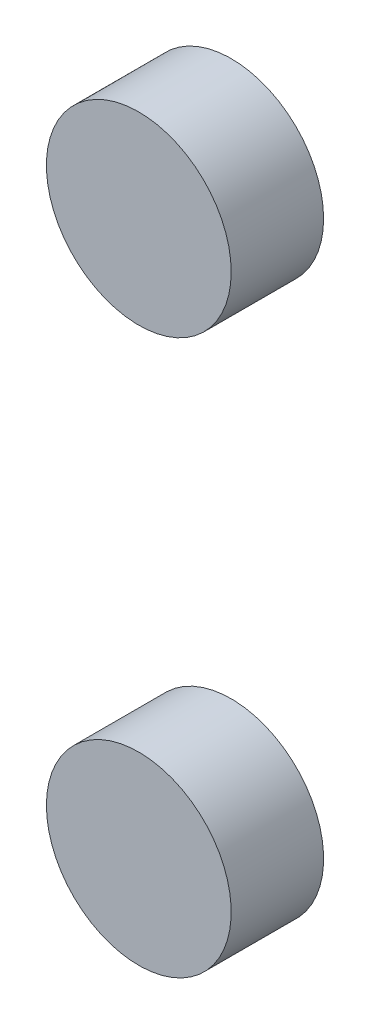
ISO-10303-21;
HEADER;
FILE_DESCRIPTION(('STEP AP214'),'2;1');
FILE_NAME('part.step','',(''),(''),'','','');
FILE_SCHEMA(('AUTOMOTIVE_DESIGN { 1 0 10303 214 1 1 1 1 }'));
ENDSEC;
DATA;
#1=APPLICATION_CONTEXT('core data for automotive mechanical design processes');
#2=APPLICATION_PROTOCOL_DEFINITION('international standard','automotive_design',2000,#1);
#3=PRODUCT_CONTEXT('',#1,'mechanical');
#4=PRODUCT('Part','Part','',(#3));
#5=PRODUCT_RELATED_PRODUCT_CATEGORY('part','',(#4));
#6=PRODUCT_DEFINITION_FORMATION('','',#4);
#7=PRODUCT_DEFINITION_CONTEXT('part definition',#1,'design');
#8=PRODUCT_DEFINITION('design','',#6,#7);
#9=PRODUCT_DEFINITION_SHAPE('','',#8);
#10=(LENGTH_UNIT() NAMED_UNIT(*) SI_UNIT(.MILLI.,.METRE.));
#11=(NAMED_UNIT(*) PLANE_ANGLE_UNIT() SI_UNIT($,.RADIAN.));
#12=(NAMED_UNIT(*) SI_UNIT($,.STERADIAN.) SOLID_ANGLE_UNIT());
#13=UNCERTAINTY_MEASURE_WITH_UNIT(LENGTH_MEASURE(1.E-05),#10,'distance_accuracy_value','');
#14=(GEOMETRIC_REPRESENTATION_CONTEXT(3) GLOBAL_UNCERTAINTY_ASSIGNED_CONTEXT((#13)) GLOBAL_UNIT_ASSIGNED_CONTEXT((#10,
#11,#12)) REPRESENTATION_CONTEXT('',''));
#15=CARTESIAN_POINT('',(0.,0.,0.));
#16=DIRECTION('',(0.,0.,1.));
#17=DIRECTION('',(1.,0.,0.));
#18=AXIS2_PLACEMENT_3D('',#15,#16,#17);
#19=CARTESIAN_POINT('',(0.,-6.,2.));
#20=DIRECTION('',(0.,0.,-1.));
#21=DIRECTION('',(-1.,0.,0.));
#22=AXIS2_PLACEMENT_3D('',#19,#20,#21);
#23=CYLINDRICAL_SURFACE('',#22,2.);
#24=CARTESIAN_POINT('',(0.,-6.,2.));
#25=DIRECTION('',(0.,0.,1.));
#26=DIRECTION('',(-1.,0.,0.));
#27=AXIS2_PLACEMENT_3D('',#24,#25,#26);
#28=CIRCLE('',#27,2.);
#29=CARTESIAN_POINT('',(-2.,-6.,2.));
#30=VERTEX_POINT('',#29);
#31=EDGE_CURVE('E11',#30,#30,#28,.T.);
#32=ORIENTED_EDGE('',*,*,#31,.F.);
#33=EDGE_LOOP('',(#32));
#34=FACE_BOUND('',#33,.T.);
#35=CARTESIAN_POINT('',(0.,-6.,0.));
#36=DIRECTION('',(0.,0.,1.));
#37=DIRECTION('',(-1.,0.,0.));
#38=AXIS2_PLACEMENT_3D('',#35,#36,#37);
#39=CIRCLE('',#38,2.);
#40=CARTESIAN_POINT('',(-2.,-6.,0.));
#41=VERTEX_POINT('',#40);
#42=EDGE_CURVE('E42',#41,#41,#39,.T.);
#43=ORIENTED_EDGE('',*,*,#42,.T.);
#44=EDGE_LOOP('',(#43));
#45=FACE_BOUND('',#44,.T.);
#46=ADVANCED_FACE('F39',(#34,#45),#23,.T.);
#47=CARTESIAN_POINT('',(0.,-6.,2.));
#48=DIRECTION('',(0.,0.,-1.));
#49=DIRECTION('',(-1.,0.,0.));
#50=AXIS2_PLACEMENT_3D('',#47,#48,#49);
#51=PLANE('',#50);
#52=ORIENTED_EDGE('',*,*,#31,.T.);
#53=EDGE_LOOP('',(#52));
#54=FACE_BOUND('',#53,.T.);
#55=ADVANCED_FACE('F54',(#54),#51,.F.);
#56=CARTESIAN_POINT('',(0.,-6.,0.));
#57=DIRECTION('',(0.,0.,-1.));
#58=DIRECTION('',(-1.,0.,0.));
#59=AXIS2_PLACEMENT_3D('',#56,#57,#58);
#60=PLANE('',#59);
#61=ORIENTED_EDGE('',*,*,#42,.F.);
#62=EDGE_LOOP('',(#61));
#63=FACE_BOUND('',#62,.T.);
#64=ADVANCED_FACE('F52',(#63),#60,.T.);
#65=CLOSED_SHELL('',(#46,#55,#64));
#66=MANIFOLD_SOLID_BREP('B2',#65);
#67=CARTESIAN_POINT('',(0.,6.,2.));
#68=DIRECTION('',(0.,0.,-1.));
#69=DIRECTION('',(-1.,0.,0.));
#70=AXIS2_PLACEMENT_3D('',#67,#68,#69);
#71=CYLINDRICAL_SURFACE('',#70,2.);
#72=CARTESIAN_POINT('',(0.,6.,2.));
#73=DIRECTION('',(0.,0.,1.));
#74=DIRECTION('',(1.,0.,0.));
#75=AXIS2_PLACEMENT_3D('',#72,#73,#74);
#76=CIRCLE('',#75,2.);
#77=CARTESIAN_POINT('',(2.,6.,2.));
#78=VERTEX_POINT('',#77);
#79=EDGE_CURVE('E38',#78,#78,#76,.T.);
#80=ORIENTED_EDGE('',*,*,#79,.F.);
#81=EDGE_LOOP('',(#80));
#82=FACE_BOUND('',#81,.T.);
#83=CARTESIAN_POINT('',(0.,6.,0.));
#84=DIRECTION('',(0.,0.,1.));
#85=DIRECTION('',(1.,0.,0.));
#86=AXIS2_PLACEMENT_3D('',#83,#84,#85);
#87=CIRCLE('',#86,2.);
#88=CARTESIAN_POINT('',(2.,6.,0.));
#89=VERTEX_POINT('',#88);
#90=EDGE_CURVE('E83',#89,#89,#87,.T.);
#91=ORIENTED_EDGE('',*,*,#90,.T.);
#92=EDGE_LOOP('',(#91));
#93=FACE_BOUND('',#92,.T.);
#94=ADVANCED_FACE('F80',(#82,#93),#71,.T.);
#95=CARTESIAN_POINT('',(0.,6.,2.));
#96=DIRECTION('',(0.,0.,1.));
#97=DIRECTION('',(1.,0.,0.));
#98=AXIS2_PLACEMENT_3D('',#95,#96,#97);
#99=PLANE('',#98);
#100=ORIENTED_EDGE('',*,*,#79,.T.);
#101=EDGE_LOOP('',(#100));
#102=FACE_BOUND('',#101,.T.);
#103=ADVANCED_FACE('F95',(#102),#99,.T.);
#104=CARTESIAN_POINT('',(0.,6.,0.));
#105=DIRECTION('',(0.,0.,1.));
#106=DIRECTION('',(1.,0.,0.));
#107=AXIS2_PLACEMENT_3D('',#104,#105,#106);
#108=PLANE('',#107);
#109=ORIENTED_EDGE('',*,*,#90,.F.);
#110=EDGE_LOOP('',(#109));
#111=FACE_BOUND('',#110,.T.);
#112=ADVANCED_FACE('F93',(#111),#108,.F.);
#113=CLOSED_SHELL('',(#94,#103,#112));
#114=MANIFOLD_SOLID_BREP('B6',#113);
#115=ADVANCED_BREP_SHAPE_REPRESENTATION('',(#18,#66,#114),#14);
#116=SHAPE_DEFINITION_REPRESENTATION(#9,#115);
ENDSEC;
END-ISO-10303-21;
